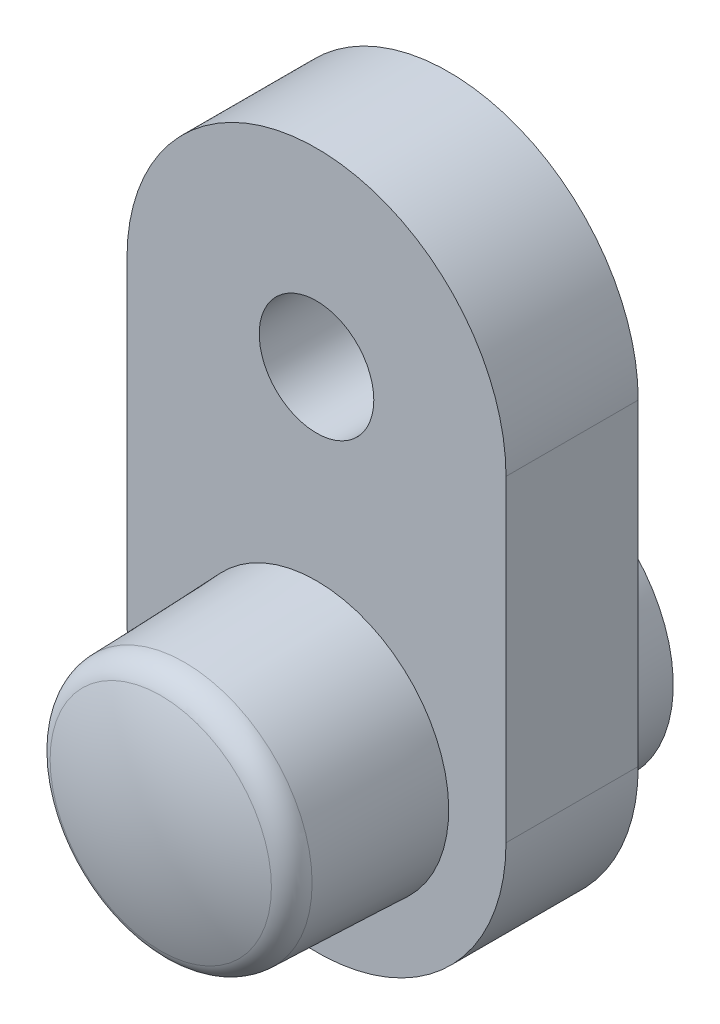
ISO-10303-21;
HEADER;
FILE_DESCRIPTION(('STEP AP214'),'2;1');
FILE_NAME('part.step','',(''),(''),'','','');
FILE_SCHEMA(('AUTOMOTIVE_DESIGN { 1 0 10303 214 1 1 1 1 }'));
ENDSEC;
DATA;
#1=APPLICATION_CONTEXT('core data for automotive mechanical design processes');
#2=APPLICATION_PROTOCOL_DEFINITION('international standard','automotive_design',2000,#1);
#3=PRODUCT_CONTEXT('',#1,'mechanical');
#4=PRODUCT('Part','Part','',(#3));
#5=PRODUCT_RELATED_PRODUCT_CATEGORY('part','',(#4));
#6=PRODUCT_DEFINITION_FORMATION('','',#4);
#7=PRODUCT_DEFINITION_CONTEXT('part definition',#1,'design');
#8=PRODUCT_DEFINITION('design','',#6,#7);
#9=PRODUCT_DEFINITION_SHAPE('','',#8);
#10=(LENGTH_UNIT() NAMED_UNIT(*) SI_UNIT(.MILLI.,.METRE.));
#11=(NAMED_UNIT(*) PLANE_ANGLE_UNIT() SI_UNIT($,.RADIAN.));
#12=(NAMED_UNIT(*) SI_UNIT($,.STERADIAN.) SOLID_ANGLE_UNIT());
#13=UNCERTAINTY_MEASURE_WITH_UNIT(LENGTH_MEASURE(1.E-05),#10,'distance_accuracy_value','');
#14=(GEOMETRIC_REPRESENTATION_CONTEXT(3) GLOBAL_UNCERTAINTY_ASSIGNED_CONTEXT((#13)) GLOBAL_UNIT_ASSIGNED_CONTEXT((#10,
#11,#12)) REPRESENTATION_CONTEXT('',''));
#15=CARTESIAN_POINT('',(0.,0.,0.));
#16=DIRECTION('',(0.,0.,1.));
#17=DIRECTION('',(1.,0.,0.));
#18=AXIS2_PLACEMENT_3D('',#15,#16,#17);
#19=CARTESIAN_POINT('',(-19.7,0.,10.45));
#20=DIRECTION('',(1.,0.,0.));
#21=DIRECTION('',(0.,0.808436609394993,0.588583255444739));
#22=AXIS2_PLACEMENT_3D('',#19,#20,#21);
#23=SPHERICAL_SURFACE('',#22,1.75);
#24=CARTESIAN_POINT('',(-19.7,0.,10.45));
#25=DIRECTION('',(0.,0.,-1.));
#26=DIRECTION('',(-1.,0.,0.));
#27=AXIS2_PLACEMENT_3D('',#24,#25,#26);
#28=SPHERICAL_SURFACE('',#27,1.75);
#29=CARTESIAN_POINT('',(-19.7,0.,11.5));
#30=DIRECTION('',(0.,0.,-1.));
#31=DIRECTION('',(-1.,0.,0.));
#32=AXIS2_PLACEMENT_3D('',#29,#30,#31);
#33=CIRCLE('',#32,1.4);
#34=CARTESIAN_POINT('',(-21.1,0.,11.5));
#35=VERTEX_POINT('',#34);
#36=EDGE_CURVE('E21',#35,#35,#33,.F.);
#37=ORIENTED_EDGE('',*,*,#36,.F.);
#38=EDGE_LOOP('',(#37));
#39=FACE_BOUND('',#38,.T.);
#40=ADVANCED_FACE('F17',(#39),#28,.F.);
#41=CARTESIAN_POINT('',(0.,0.,11.5));
#42=DIRECTION('',(0.,0.,-1.));
#43=DIRECTION('',(-1.,0.,0.));
#44=AXIS2_PLACEMENT_3D('',#41,#42,#43);
#45=PLANE('',#44);
#46=CARTESIAN_POINT('',(-19.7,0.,11.5000000000123));
#47=DIRECTION('',(0.,0.,1.));
#48=DIRECTION('',(0.,-1.,0.));
#49=AXIS2_PLACEMENT_3D('',#46,#47,#48);
#50=CIRCLE('',#49,1.54759222071319);
#51=CARTESIAN_POINT('',(-19.7,-1.54759222071319,11.5000000000123));
#52=VERTEX_POINT('',#51);
#53=EDGE_CURVE('E108',#52,#52,#50,.T.);
#54=ORIENTED_EDGE('',*,*,#53,.F.);
#55=EDGE_LOOP('',(#54));
#56=FACE_BOUND('',#55,.T.);
#57=ORIENTED_EDGE('',*,*,#36,.T.);
#58=EDGE_LOOP('',(#57));
#59=FACE_BOUND('',#58,.T.);
#60=ADVANCED_FACE('F115',(#56,#59),#45,.T.);
#61=CARTESIAN_POINT('',(-19.7,0.,12.5));
#62=DIRECTION('',(-0.707106781186545,0.70710678118655,0.));
#63=DIRECTION('',(-0.258280272722729,-0.258280272722738,0.930904184889369));
#64=AXIS2_PLACEMENT_3D('',#61,#62,#63);
#65=SPHERICAL_SURFACE('',#64,3.49999999999996);
#66=CARTESIAN_POINT('',(-19.7,0.,12.5));
#67=DIRECTION('',(0.,0.,-1.));
#68=DIRECTION('',(-1.,0.,0.));
#69=AXIS2_PLACEMENT_3D('',#66,#67,#68);
#70=SPHERICAL_SURFACE('',#69,3.49999999999996);
#71=CARTESIAN_POINT('',(-19.7,0.,15.7670645897516));
#72=DIRECTION('',(0.,0.,-1.));
#73=DIRECTION('',(-1.,0.,0.));
#74=AXIS2_PLACEMENT_3D('',#71,#72,#73);
#75=CIRCLE('',#74,1.25550347127504);
#76=CARTESIAN_POINT('',(-20.955503471275,0.,15.7670645897516));
#77=VERTEX_POINT('',#76);
#78=EDGE_CURVE('E106',#77,#77,#75,.T.);
#79=ORIENTED_EDGE('',*,*,#78,.F.);
#80=EDGE_LOOP('',(#79));
#81=FACE_BOUND('',#80,.T.);
#82=ADVANCED_FACE('F123',(#81),#70,.T.);
#83=CARTESIAN_POINT('',(-19.7,0.,12.4999999999886));
#84=DIRECTION('',(0.,0.,1.));
#85=DIRECTION('',(0.,-1.,0.));
#86=AXIS2_PLACEMENT_3D('',#83,#84,#85);
#87=CONICAL_SURFACE('',#86,1.59999999999627,0.0523598775611032);
#88=ORIENTED_EDGE('',*,*,#53,.T.);
#89=EDGE_LOOP('',(#88));
#90=FACE_BOUND('',#89,.T.);
#91=CARTESIAN_POINT('',(-19.7,0.,12.4999999999886));
#92=DIRECTION('',(0.,0.,1.));
#93=DIRECTION('',(0.,-1.,0.));
#94=AXIS2_PLACEMENT_3D('',#91,#92,#93);
#95=CIRCLE('',#94,1.59999999999627);
#96=CARTESIAN_POINT('',(-19.7,-1.59999999999627,12.4999999999886));
#97=VERTEX_POINT('',#96);
#98=EDGE_CURVE('E103',#97,#97,#95,.T.);
#99=ORIENTED_EDGE('',*,*,#98,.F.);
#100=EDGE_LOOP('',(#99));
#101=FACE_BOUND('',#100,.T.);
#102=ADVANCED_FACE('F156',(#90,#101),#87,.T.);
#103=CARTESIAN_POINT('',(-19.7,0.,15.48703048206));
#104=DIRECTION('',(0.,0.,-1.));
#105=DIRECTION('',(-1.,0.,0.));
#106=AXIS2_PLACEMENT_3D('',#103,#104,#105);
#107=TOROIDAL_SURFACE('',#106,1.147888888019,0.300000000000001);
#108=ORIENTED_EDGE('',*,*,#78,.T.);
#109=EDGE_LOOP('',(#108));
#110=FACE_BOUND('',#109,.T.);
#111=CARTESIAN_POINT('',(-19.7,0.,15.4975003310938));
#112=DIRECTION('',(0.,0.,-1.));
#113=DIRECTION('',(-1.,0.,0.));
#114=AXIS2_PLACEMENT_3D('',#111,#112,#113);
#115=CIRCLE('',#114,1.44770613612649);
#116=CARTESIAN_POINT('',(-21.1477061361265,0.,15.4975003310938));
#117=VERTEX_POINT('',#116);
#118=EDGE_CURVE('E68',#117,#117,#115,.T.);
#119=ORIENTED_EDGE('',*,*,#118,.F.);
#120=EDGE_LOOP('',(#119));
#121=FACE_BOUND('',#120,.T.);
#122=ADVANCED_FACE('F19',(#110,#121),#107,.T.);
#123=CARTESIAN_POINT('',(0.,0.,12.5));
#124=DIRECTION('',(0.,0.,-1.));
#125=DIRECTION('',(-1.,0.,0.));
#126=AXIS2_PLACEMENT_3D('',#123,#124,#125);
#127=PLANE('',#126);
#128=CARTESIAN_POINT('',(-19.7,3.6,12.5));
#129=DIRECTION('',(0.,0.,-1.));
#130=DIRECTION('',(-1.,0.,0.));
#131=AXIS2_PLACEMENT_3D('',#128,#129,#130);
#132=CIRCLE('',#131,2.15);
#133=CARTESIAN_POINT('',(-17.55,3.6,12.5));
#134=VERTEX_POINT('',#133);
#135=CARTESIAN_POINT('',(-21.85,3.6,12.5));
#136=VERTEX_POINT('',#135);
#137=EDGE_CURVE('E99',#134,#136,#132,.F.);
#138=ORIENTED_EDGE('',*,*,#137,.F.);
#139=DIRECTION('',(0.,1.,0.));
#140=VECTOR('',#139,1.);
#141=CARTESIAN_POINT('',(-17.55,3.6,12.5));
#142=LINE('',#141,#140);
#143=CARTESIAN_POINT('',(-17.55,0.,12.5));
#144=VERTEX_POINT('',#143);
#145=EDGE_CURVE('E62',#144,#134,#142,.T.);
#146=ORIENTED_EDGE('',*,*,#145,.F.);
#147=CARTESIAN_POINT('',(-19.7,0.,12.5));
#148=DIRECTION('',(0.,0.,-1.));
#149=DIRECTION('',(-1.,0.,0.));
#150=AXIS2_PLACEMENT_3D('',#147,#148,#149);
#151=CIRCLE('',#150,2.15);
#152=CARTESIAN_POINT('',(-21.85,0.,12.5));
#153=VERTEX_POINT('',#152);
#154=EDGE_CURVE('E56',#153,#144,#151,.F.);
#155=ORIENTED_EDGE('',*,*,#154,.F.);
#156=DIRECTION('',(0.,1.,0.));
#157=VECTOR('',#156,1.);
#158=CARTESIAN_POINT('',(-21.85,0.,12.5));
#159=LINE('',#158,#157);
#160=EDGE_CURVE('E60',#136,#153,#159,.F.);
#161=ORIENTED_EDGE('',*,*,#160,.F.);
#162=EDGE_LOOP('',(#138,#146,#155,#161));
#163=FACE_BOUND('',#162,.T.);
#164=CARTESIAN_POINT('',(-19.7,3.6,12.5));
#165=DIRECTION('',(0.,0.,1.));
#166=DIRECTION('',(1.,0.,0.));
#167=AXIS2_PLACEMENT_3D('',#164,#165,#166);
#168=CIRCLE('',#167,0.650000000000001);
#169=CARTESIAN_POINT('',(-19.05,3.6,12.5));
#170=VERTEX_POINT('',#169);
#171=EDGE_CURVE('E89',#170,#170,#168,.T.);
#172=ORIENTED_EDGE('',*,*,#171,.T.);
#173=EDGE_LOOP('',(#172));
#174=FACE_BOUND('',#173,.T.);
#175=ORIENTED_EDGE('',*,*,#98,.T.);
#176=EDGE_LOOP('',(#175));
#177=FACE_BOUND('',#176,.T.);
#178=ADVANCED_FACE('F58',(#163,#174,#177),#127,.T.);
#179=CARTESIAN_POINT('',(-19.7,3.6,14.));
#180=DIRECTION('',(0.,0.,1.));
#181=DIRECTION('',(1.,0.,0.));
#182=AXIS2_PLACEMENT_3D('',#179,#180,#181);
#183=CYLINDRICAL_SURFACE('',#182,0.650000000000001);
#184=ORIENTED_EDGE('',*,*,#171,.F.);
#185=EDGE_LOOP('',(#184));
#186=FACE_BOUND('',#185,.T.);
#187=CARTESIAN_POINT('',(-19.7,3.6,14.));
#188=DIRECTION('',(0.,0.,1.));
#189=DIRECTION('',(1.,0.,0.));
#190=AXIS2_PLACEMENT_3D('',#187,#188,#189);
#191=CIRCLE('',#190,0.650000000000001);
#192=CARTESIAN_POINT('',(-19.05,3.6,14.));
#193=VERTEX_POINT('',#192);
#194=EDGE_CURVE('E84',#193,#193,#191,.T.);
#195=ORIENTED_EDGE('',*,*,#194,.T.);
#196=EDGE_LOOP('',(#195));
#197=FACE_BOUND('',#196,.T.);
#198=ADVANCED_FACE('F149',(#186,#197),#183,.F.);
#199=CARTESIAN_POINT('',(-19.7,0.,14.0000000000668));
#200=DIRECTION('',(0.,0.,-1.));
#201=DIRECTION('',(0.,1.,0.));
#202=AXIS2_PLACEMENT_3D('',#199,#200,#201);
#203=CONICAL_SURFACE('',#202,1.50000000000388,0.0349065850424133);
#204=ORIENTED_EDGE('',*,*,#118,.T.);
#205=EDGE_LOOP('',(#204));
#206=FACE_BOUND('',#205,.T.);
#207=CARTESIAN_POINT('',(-19.7,0.,14.00000000001));
#208=DIRECTION('',(0.,0.,-1.));
#209=DIRECTION('',(0.,1.,0.));
#210=AXIS2_PLACEMENT_3D('',#207,#208,#209);
#211=CIRCLE('',#210,1.50000000000587);
#212=CARTESIAN_POINT('',(-19.7,1.50000000000587,14.00000000001));
#213=VERTEX_POINT('',#212);
#214=EDGE_CURVE('E94',#213,#213,#211,.F.);
#215=ORIENTED_EDGE('',*,*,#214,.T.);
#216=EDGE_LOOP('',(#215));
#217=FACE_BOUND('',#216,.T.);
#218=ADVANCED_FACE('F146',(#206,#217),#203,.T.);
#219=CARTESIAN_POINT('',(-19.7,0.,14.));
#220=DIRECTION('',(0.,0.,-1.));
#221=DIRECTION('',(-1.,0.,0.));
#222=AXIS2_PLACEMENT_3D('',#219,#220,#221);
#223=CYLINDRICAL_SURFACE('',#222,2.15);
#224=DIRECTION('',(0.,0.,1.));
#225=VECTOR('',#224,1.);
#226=CARTESIAN_POINT('',(-21.85,0.,14.));
#227=LINE('',#226,#225);
#228=CARTESIAN_POINT('',(-21.85,0.,14.));
#229=VERTEX_POINT('',#228);
#230=EDGE_CURVE('E67',#153,#229,#227,.T.);
#231=ORIENTED_EDGE('',*,*,#230,.F.);
#232=ORIENTED_EDGE('',*,*,#154,.T.);
#233=DIRECTION('',(0.,0.,-1.));
#234=VECTOR('',#233,1.);
#235=CARTESIAN_POINT('',(-17.55,0.,14.));
#236=LINE('',#235,#234);
#237=CARTESIAN_POINT('',(-17.55,0.,14.));
#238=VERTEX_POINT('',#237);
#239=EDGE_CURVE('E85',#238,#144,#236,.T.);
#240=ORIENTED_EDGE('',*,*,#239,.F.);
#241=CARTESIAN_POINT('',(-19.7,0.,14.));
#242=DIRECTION('',(0.,0.,-1.));
#243=DIRECTION('',(-1.,0.,0.));
#244=AXIS2_PLACEMENT_3D('',#241,#242,#243);
#245=CIRCLE('',#244,2.15);
#246=EDGE_CURVE('E79',#238,#229,#245,.T.);
#247=ORIENTED_EDGE('',*,*,#246,.T.);
#248=EDGE_LOOP('',(#231,#232,#240,#247));
#249=FACE_BOUND('',#248,.T.);
#250=ADVANCED_FACE('F78',(#249),#223,.T.);
#251=CARTESIAN_POINT('',(-21.85,0.,14.));
#252=DIRECTION('',(-1.,0.,0.));
#253=DIRECTION('',(0.,0.,1.));
#254=AXIS2_PLACEMENT_3D('',#251,#252,#253);
#255=PLANE('',#254);
#256=DIRECTION('',(0.,0.,-1.));
#257=VECTOR('',#256,1.);
#258=CARTESIAN_POINT('',(-21.85,3.6,14.));
#259=LINE('',#258,#257);
#260=CARTESIAN_POINT('',(-21.85,3.6,14.));
#261=VERTEX_POINT('',#260);
#262=EDGE_CURVE('E75',#136,#261,#259,.F.);
#263=ORIENTED_EDGE('',*,*,#262,.F.);
#264=ORIENTED_EDGE('',*,*,#160,.T.);
#265=ORIENTED_EDGE('',*,*,#230,.T.);
#266=DIRECTION('',(0.,1.,0.));
#267=VECTOR('',#266,1.);
#268=CARTESIAN_POINT('',(-21.85,0.,14.));
#269=LINE('',#268,#267);
#270=EDGE_CURVE('E92',#229,#261,#269,.T.);
#271=ORIENTED_EDGE('',*,*,#270,.T.);
#272=EDGE_LOOP('',(#263,#264,#265,#271));
#273=FACE_BOUND('',#272,.T.);
#274=ADVANCED_FACE('F72',(#273),#255,.T.);
#275=CARTESIAN_POINT('',(-19.7,3.6,14.));
#276=DIRECTION('',(0.,0.,-1.));
#277=DIRECTION('',(-1.,0.,0.));
#278=AXIS2_PLACEMENT_3D('',#275,#276,#277);
#279=CYLINDRICAL_SURFACE('',#278,2.15);
#280=DIRECTION('',(0.,0.,-1.));
#281=VECTOR('',#280,1.);
#282=CARTESIAN_POINT('',(-17.55,3.6,14.));
#283=LINE('',#282,#281);
#284=CARTESIAN_POINT('',(-17.55,3.6,14.));
#285=VERTEX_POINT('',#284);
#286=EDGE_CURVE('E35',#134,#285,#283,.F.);
#287=ORIENTED_EDGE('',*,*,#286,.F.);
#288=ORIENTED_EDGE('',*,*,#137,.T.);
#289=ORIENTED_EDGE('',*,*,#262,.T.);
#290=CARTESIAN_POINT('',(-19.7,3.6,14.));
#291=DIRECTION('',(0.,0.,-1.));
#292=DIRECTION('',(-1.,0.,0.));
#293=AXIS2_PLACEMENT_3D('',#290,#291,#292);
#294=CIRCLE('',#293,2.15);
#295=EDGE_CURVE('E27',#261,#285,#294,.T.);
#296=ORIENTED_EDGE('',*,*,#295,.T.);
#297=EDGE_LOOP('',(#287,#288,#289,#296));
#298=FACE_BOUND('',#297,.T.);
#299=ADVANCED_FACE('F134',(#298),#279,.T.);
#300=CARTESIAN_POINT('',(-17.55,3.6,14.));
#301=DIRECTION('',(1.,0.,0.));
#302=DIRECTION('',(0.,0.,-1.));
#303=AXIS2_PLACEMENT_3D('',#300,#301,#302);
#304=PLANE('',#303);
#305=ORIENTED_EDGE('',*,*,#239,.T.);
#306=ORIENTED_EDGE('',*,*,#145,.T.);
#307=ORIENTED_EDGE('',*,*,#286,.T.);
#308=DIRECTION('',(0.,1.,0.));
#309=VECTOR('',#308,1.);
#310=CARTESIAN_POINT('',(-17.55,0.,14.));
#311=LINE('',#310,#309);
#312=EDGE_CURVE('E11',#285,#238,#311,.F.);
#313=ORIENTED_EDGE('',*,*,#312,.T.);
#314=EDGE_LOOP('',(#305,#306,#307,#313));
#315=FACE_BOUND('',#314,.T.);
#316=ADVANCED_FACE('F128',(#315),#304,.T.);
#317=CARTESIAN_POINT('',(0.,0.,14.));
#318=DIRECTION('',(0.,0.,-1.));
#319=DIRECTION('',(-1.,0.,0.));
#320=AXIS2_PLACEMENT_3D('',#317,#318,#319);
#321=PLANE('',#320);
#322=ORIENTED_EDGE('',*,*,#295,.F.);
#323=ORIENTED_EDGE('',*,*,#270,.F.);
#324=ORIENTED_EDGE('',*,*,#246,.F.);
#325=ORIENTED_EDGE('',*,*,#312,.F.);
#326=EDGE_LOOP('',(#322,#323,#324,#325));
#327=FACE_BOUND('',#326,.T.);
#328=ORIENTED_EDGE('',*,*,#214,.F.);
#329=EDGE_LOOP('',(#328));
#330=FACE_BOUND('',#329,.T.);
#331=ORIENTED_EDGE('',*,*,#194,.F.);
#332=EDGE_LOOP('',(#331));
#333=FACE_BOUND('',#332,.T.);
#334=ADVANCED_FACE('F126',(#327,#330,#333),#321,.F.);
#335=CLOSED_SHELL('',(#40,#60,#82,#102,#122,#178,#198,#218,#250,#274,#299,#316,#334));
#336=MANIFOLD_SOLID_BREP('B1',#335);
#337=ADVANCED_BREP_SHAPE_REPRESENTATION('',(#18,#336),#14);
#338=SHAPE_DEFINITION_REPRESENTATION(#9,#337);
ENDSEC;
END-ISO-10303-21;
